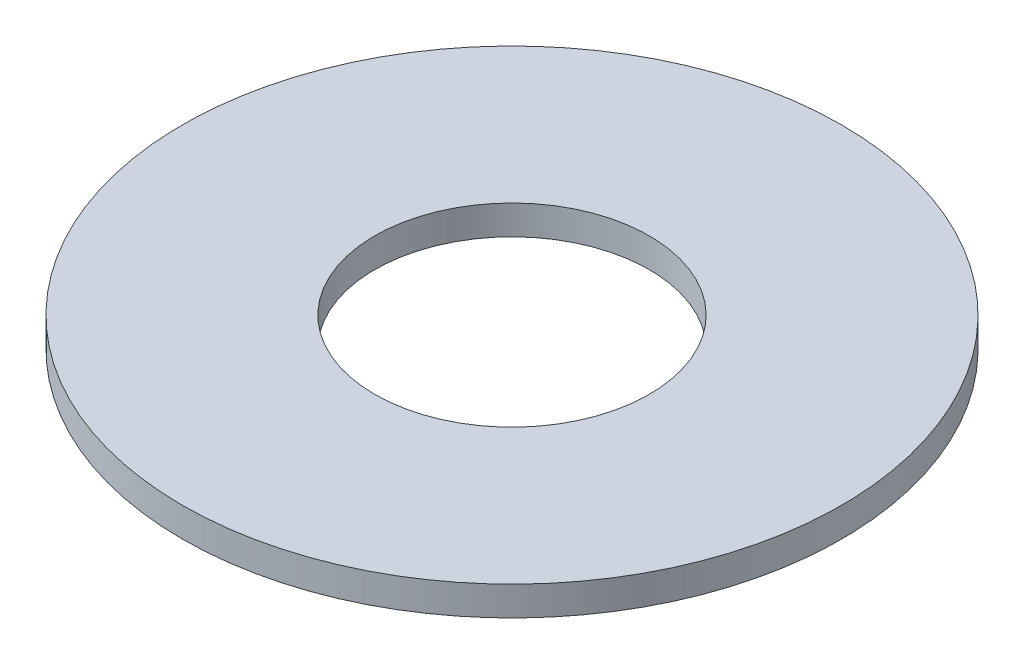
ISO-10303-21;
HEADER;
FILE_DESCRIPTION(('STEP AP214'),'2;1');
FILE_NAME('part.step','',(''),(''),'','','');
FILE_SCHEMA(('AUTOMOTIVE_DESIGN { 1 0 10303 214 1 1 1 1 }'));
ENDSEC;
DATA;
#1=APPLICATION_CONTEXT('core data for automotive mechanical design processes');
#2=APPLICATION_PROTOCOL_DEFINITION('international standard','automotive_design',2000,#1);
#3=PRODUCT_CONTEXT('',#1,'mechanical');
#4=PRODUCT('Part','Part','',(#3));
#5=PRODUCT_RELATED_PRODUCT_CATEGORY('part','',(#4));
#6=PRODUCT_DEFINITION_FORMATION('','',#4);
#7=PRODUCT_DEFINITION_CONTEXT('part definition',#1,'design');
#8=PRODUCT_DEFINITION('design','',#6,#7);
#9=PRODUCT_DEFINITION_SHAPE('','',#8);
#10=(LENGTH_UNIT() NAMED_UNIT(*) SI_UNIT(.MILLI.,.METRE.));
#11=(NAMED_UNIT(*) PLANE_ANGLE_UNIT() SI_UNIT($,.RADIAN.));
#12=(NAMED_UNIT(*) SI_UNIT($,.STERADIAN.) SOLID_ANGLE_UNIT());
#13=UNCERTAINTY_MEASURE_WITH_UNIT(LENGTH_MEASURE(1.E-05),#10,'distance_accuracy_value','');
#14=(GEOMETRIC_REPRESENTATION_CONTEXT(3) GLOBAL_UNCERTAINTY_ASSIGNED_CONTEXT((#13)) GLOBAL_UNIT_ASSIGNED_CONTEXT((#10,
#11,#12)) REPRESENTATION_CONTEXT('',''));
#15=CARTESIAN_POINT('',(0.,0.,0.));
#16=DIRECTION('',(0.,0.,1.));
#17=DIRECTION('',(1.,0.,0.));
#18=AXIS2_PLACEMENT_3D('',#15,#16,#17);
#19=CARTESIAN_POINT('',(0.,1.27,0.));
#20=DIRECTION('',(0.,-1.,0.));
#21=DIRECTION('',(0.,0.,-1.));
#22=AXIS2_PLACEMENT_3D('',#19,#20,#21);
#23=CYLINDRICAL_SURFACE('',#22,14.2875);
#24=CARTESIAN_POINT('',(0.,1.27,0.));
#25=DIRECTION('',(0.,1.,0.));
#26=DIRECTION('',(0.,0.,1.));
#27=AXIS2_PLACEMENT_3D('',#24,#25,#26);
#28=CIRCLE('',#27,14.2875);
#29=CARTESIAN_POINT('',(0.,1.27,14.2875));
#30=VERTEX_POINT('',#29);
#31=EDGE_CURVE('E10',#30,#30,#28,.T.);
#32=ORIENTED_EDGE('',*,*,#31,.F.);
#33=EDGE_LOOP('',(#32));
#34=FACE_BOUND('',#33,.T.);
#35=CARTESIAN_POINT('',(0.,0.,0.));
#36=DIRECTION('',(0.,1.,0.));
#37=DIRECTION('',(0.,0.,1.));
#38=AXIS2_PLACEMENT_3D('',#35,#36,#37);
#39=CIRCLE('',#38,14.2875);
#40=CARTESIAN_POINT('',(0.,0.,14.2875));
#41=VERTEX_POINT('',#40);
#42=EDGE_CURVE('E35',#41,#41,#39,.T.);
#43=ORIENTED_EDGE('',*,*,#42,.T.);
#44=EDGE_LOOP('',(#43));
#45=FACE_BOUND('',#44,.T.);
#46=ADVANCED_FACE('F32',(#34,#45),#23,.T.);
#47=CARTESIAN_POINT('',(0.,1.27,0.));
#48=DIRECTION('',(0.,1.,0.));
#49=DIRECTION('',(0.,0.,1.));
#50=AXIS2_PLACEMENT_3D('',#47,#48,#49);
#51=PLANE('',#50);
#52=CARTESIAN_POINT('',(0.,1.27,0.));
#53=DIRECTION('',(0.,1.,0.));
#54=DIRECTION('',(0.,0.,1.));
#55=AXIS2_PLACEMENT_3D('',#52,#53,#54);
#56=CIRCLE('',#55,5.95249);
#57=CARTESIAN_POINT('',(0.,1.27,5.95249));
#58=VERTEX_POINT('',#57);
#59=EDGE_CURVE('E46',#58,#58,#56,.T.);
#60=ORIENTED_EDGE('',*,*,#59,.F.);
#61=EDGE_LOOP('',(#60));
#62=FACE_BOUND('',#61,.T.);
#63=ORIENTED_EDGE('',*,*,#31,.T.);
#64=EDGE_LOOP('',(#63));
#65=FACE_BOUND('',#64,.T.);
#66=ADVANCED_FACE('F52',(#62,#65),#51,.T.);
#67=CARTESIAN_POINT('',(0.,0.,0.));
#68=DIRECTION('',(0.,1.,0.));
#69=DIRECTION('',(0.,0.,1.));
#70=AXIS2_PLACEMENT_3D('',#67,#68,#69);
#71=PLANE('',#70);
#72=CARTESIAN_POINT('',(0.,0.,0.));
#73=DIRECTION('',(0.,1.,0.));
#74=DIRECTION('',(0.,0.,1.));
#75=AXIS2_PLACEMENT_3D('',#72,#73,#74);
#76=CIRCLE('',#75,5.95249);
#77=CARTESIAN_POINT('',(0.,0.,5.95249));
#78=VERTEX_POINT('',#77);
#79=EDGE_CURVE('E42',#78,#78,#76,.T.);
#80=ORIENTED_EDGE('',*,*,#79,.T.);
#81=EDGE_LOOP('',(#80));
#82=FACE_BOUND('',#81,.T.);
#83=ORIENTED_EDGE('',*,*,#42,.F.);
#84=EDGE_LOOP('',(#83));
#85=FACE_BOUND('',#84,.T.);
#86=ADVANCED_FACE('F54',(#82,#85),#71,.F.);
#87=CARTESIAN_POINT('',(0.,1.27,0.));
#88=DIRECTION('',(0.,1.,0.));
#89=DIRECTION('',(0.,0.,1.));
#90=AXIS2_PLACEMENT_3D('',#87,#88,#89);
#91=CYLINDRICAL_SURFACE('',#90,5.95249);
#92=ORIENTED_EDGE('',*,*,#79,.F.);
#93=EDGE_LOOP('',(#92));
#94=FACE_BOUND('',#93,.T.);
#95=ORIENTED_EDGE('',*,*,#59,.T.);
#96=EDGE_LOOP('',(#95));
#97=FACE_BOUND('',#96,.T.);
#98=ADVANCED_FACE('F50',(#94,#97),#91,.F.);
#99=CLOSED_SHELL('',(#46,#66,#86,#98));
#100=MANIFOLD_SOLID_BREP('B2',#99);
#101=ADVANCED_BREP_SHAPE_REPRESENTATION('',(#18,#100),#14);
#102=SHAPE_DEFINITION_REPRESENTATION(#9,#101);
ENDSEC;
END-ISO-10303-21;
